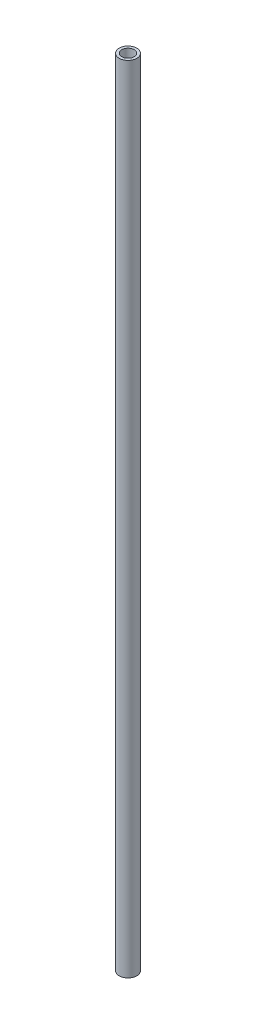
ISO-10303-21;
HEADER;
FILE_DESCRIPTION(('STEP AP214'),'2;1');
FILE_NAME('part.step','',(''),(''),'','','');
FILE_SCHEMA(('AUTOMOTIVE_DESIGN { 1 0 10303 214 1 1 1 1 }'));
ENDSEC;
DATA;
#1=APPLICATION_CONTEXT('core data for automotive mechanical design processes');
#2=APPLICATION_PROTOCOL_DEFINITION('international standard','automotive_design',2000,#1);
#3=PRODUCT_CONTEXT('',#1,'mechanical');
#4=PRODUCT('Part','Part','',(#3));
#5=PRODUCT_RELATED_PRODUCT_CATEGORY('part','',(#4));
#6=PRODUCT_DEFINITION_FORMATION('','',#4);
#7=PRODUCT_DEFINITION_CONTEXT('part definition',#1,'design');
#8=PRODUCT_DEFINITION('design','',#6,#7);
#9=PRODUCT_DEFINITION_SHAPE('','',#8);
#10=(LENGTH_UNIT() NAMED_UNIT(*) SI_UNIT(.MILLI.,.METRE.));
#11=(NAMED_UNIT(*) PLANE_ANGLE_UNIT() SI_UNIT($,.RADIAN.));
#12=(NAMED_UNIT(*) SI_UNIT($,.STERADIAN.) SOLID_ANGLE_UNIT());
#13=UNCERTAINTY_MEASURE_WITH_UNIT(LENGTH_MEASURE(1.E-05),#10,'distance_accuracy_value','');
#14=(GEOMETRIC_REPRESENTATION_CONTEXT(3) GLOBAL_UNCERTAINTY_ASSIGNED_CONTEXT((#13)) GLOBAL_UNIT_ASSIGNED_CONTEXT((#10,
#11,#12)) REPRESENTATION_CONTEXT('',''));
#15=CARTESIAN_POINT('',(0.,0.,0.));
#16=DIRECTION('',(0.,0.,1.));
#17=DIRECTION('',(1.,0.,0.));
#18=AXIS2_PLACEMENT_3D('',#15,#16,#17);
#19=CARTESIAN_POINT('',(0.,450.,0.));
#20=DIRECTION('',(0.,1.,0.));
#21=DIRECTION('',(0.,0.,1.));
#22=AXIS2_PLACEMENT_3D('',#19,#20,#21);
#23=PLANE('',#22);
#24=CARTESIAN_POINT('',(0.,450.,0.));
#25=DIRECTION('',(0.,1.,0.));
#26=DIRECTION('',(0.,0.,1.));
#27=AXIS2_PLACEMENT_3D('',#24,#25,#26);
#28=CIRCLE('',#27,5.);
#29=CARTESIAN_POINT('',(0.,450.,5.));
#30=VERTEX_POINT('',#29);
#31=EDGE_CURVE('E10',#30,#30,#28,.T.);
#32=ORIENTED_EDGE('',*,*,#31,.T.);
#33=EDGE_LOOP('',(#32));
#34=FACE_BOUND('',#33,.T.);
#35=CARTESIAN_POINT('',(0.,450.,0.));
#36=DIRECTION('',(0.,1.,0.));
#37=DIRECTION('',(0.,0.,1.));
#38=AXIS2_PLACEMENT_3D('',#35,#36,#37);
#39=CIRCLE('',#38,3.5);
#40=CARTESIAN_POINT('',(0.,450.,3.5));
#41=VERTEX_POINT('',#40);
#42=EDGE_CURVE('E45',#41,#41,#39,.T.);
#43=ORIENTED_EDGE('',*,*,#42,.F.);
#44=EDGE_LOOP('',(#43));
#45=FACE_BOUND('',#44,.T.);
#46=ADVANCED_FACE('F34',(#34,#45),#23,.T.);
#47=CARTESIAN_POINT('',(0.,0.,0.));
#48=DIRECTION('',(0.,1.,0.));
#49=DIRECTION('',(0.,0.,1.));
#50=AXIS2_PLACEMENT_3D('',#47,#48,#49);
#51=PLANE('',#50);
#52=CARTESIAN_POINT('',(0.,0.,0.));
#53=DIRECTION('',(0.,1.,0.));
#54=DIRECTION('',(0.,0.,1.));
#55=AXIS2_PLACEMENT_3D('',#52,#53,#54);
#56=CIRCLE('',#55,5.);
#57=CARTESIAN_POINT('',(0.,0.,5.));
#58=VERTEX_POINT('',#57);
#59=EDGE_CURVE('E38',#58,#58,#56,.T.);
#60=ORIENTED_EDGE('',*,*,#59,.F.);
#61=EDGE_LOOP('',(#60));
#62=FACE_BOUND('',#61,.T.);
#63=CARTESIAN_POINT('',(0.,0.,0.));
#64=DIRECTION('',(0.,1.,0.));
#65=DIRECTION('',(0.,0.,1.));
#66=AXIS2_PLACEMENT_3D('',#63,#64,#65);
#67=CIRCLE('',#66,3.5);
#68=CARTESIAN_POINT('',(0.,0.,3.5));
#69=VERTEX_POINT('',#68);
#70=EDGE_CURVE('E47',#69,#69,#67,.T.);
#71=ORIENTED_EDGE('',*,*,#70,.T.);
#72=EDGE_LOOP('',(#71));
#73=FACE_BOUND('',#72,.T.);
#74=ADVANCED_FACE('F57',(#62,#73),#51,.F.);
#75=CARTESIAN_POINT('',(0.,450.,0.));
#76=DIRECTION('',(0.,-1.,0.));
#77=DIRECTION('',(0.,0.,-1.));
#78=AXIS2_PLACEMENT_3D('',#75,#76,#77);
#79=CYLINDRICAL_SURFACE('',#78,5.);
#80=ORIENTED_EDGE('',*,*,#31,.F.);
#81=EDGE_LOOP('',(#80));
#82=FACE_BOUND('',#81,.T.);
#83=ORIENTED_EDGE('',*,*,#59,.T.);
#84=EDGE_LOOP('',(#83));
#85=FACE_BOUND('',#84,.T.);
#86=ADVANCED_FACE('F36',(#82,#85),#79,.T.);
#87=CARTESIAN_POINT('',(0.,450.,0.));
#88=DIRECTION('',(0.,-1.,0.));
#89=DIRECTION('',(0.,0.,-1.));
#90=AXIS2_PLACEMENT_3D('',#87,#88,#89);
#91=CYLINDRICAL_SURFACE('',#90,3.5);
#92=ORIENTED_EDGE('',*,*,#42,.T.);
#93=EDGE_LOOP('',(#92));
#94=FACE_BOUND('',#93,.T.);
#95=ORIENTED_EDGE('',*,*,#70,.F.);
#96=EDGE_LOOP('',(#95));
#97=FACE_BOUND('',#96,.T.);
#98=ADVANCED_FACE('F53',(#94,#97),#91,.F.);
#99=CLOSED_SHELL('',(#46,#74,#86,#98));
#100=MANIFOLD_SOLID_BREP('B2',#99);
#101=ADVANCED_BREP_SHAPE_REPRESENTATION('',(#18,#100),#14);
#102=SHAPE_DEFINITION_REPRESENTATION(#9,#101);
ENDSEC;
END-ISO-10303-21;
